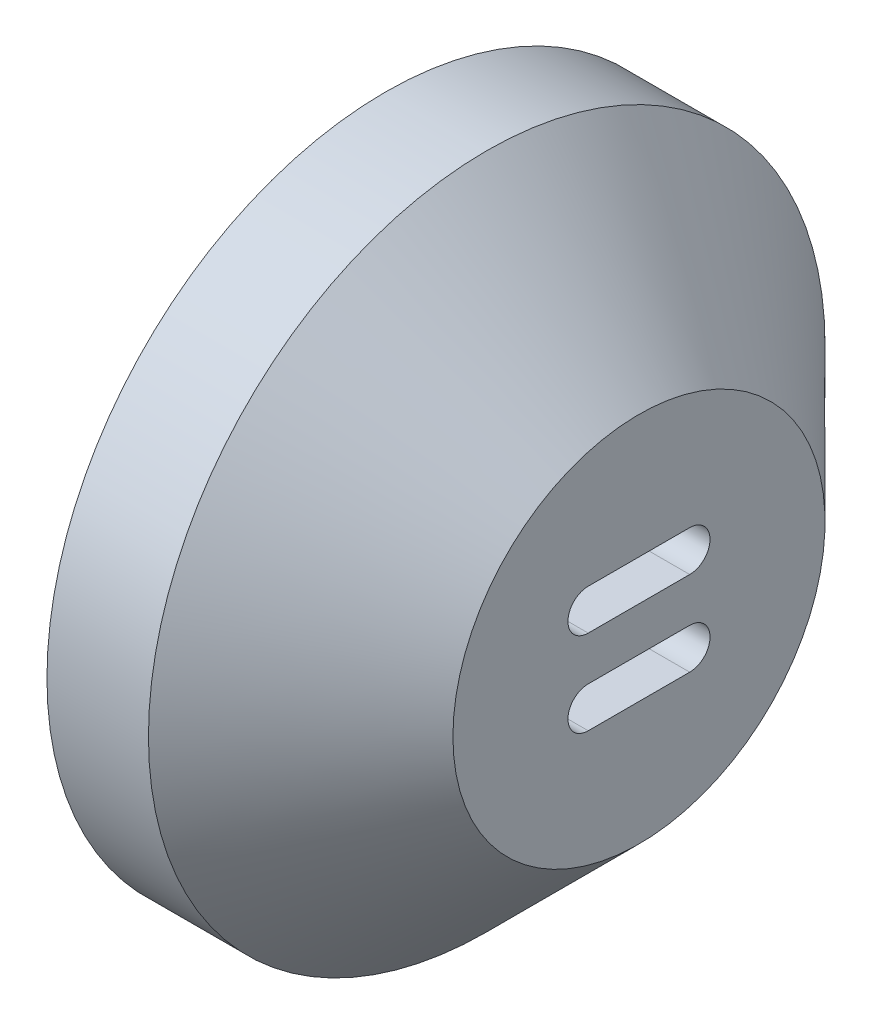
ISO-10303-21;
HEADER;
FILE_DESCRIPTION(('STEP AP214'),'2;1');
FILE_NAME('part.step','',(''),(''),'','','');
FILE_SCHEMA(('AUTOMOTIVE_DESIGN { 1 0 10303 214 1 1 1 1 }'));
ENDSEC;
DATA;
#1=APPLICATION_CONTEXT('core data for automotive mechanical design processes');
#2=APPLICATION_PROTOCOL_DEFINITION('international standard','automotive_design',2000,#1);
#3=PRODUCT_CONTEXT('',#1,'mechanical');
#4=PRODUCT('Part','Part','',(#3));
#5=PRODUCT_RELATED_PRODUCT_CATEGORY('part','',(#4));
#6=PRODUCT_DEFINITION_FORMATION('','',#4);
#7=PRODUCT_DEFINITION_CONTEXT('part definition',#1,'design');
#8=PRODUCT_DEFINITION('design','',#6,#7);
#9=PRODUCT_DEFINITION_SHAPE('','',#8);
#10=(LENGTH_UNIT() NAMED_UNIT(*) SI_UNIT(.MILLI.,.METRE.));
#11=(NAMED_UNIT(*) PLANE_ANGLE_UNIT() SI_UNIT($,.RADIAN.));
#12=(NAMED_UNIT(*) SI_UNIT($,.STERADIAN.) SOLID_ANGLE_UNIT());
#13=UNCERTAINTY_MEASURE_WITH_UNIT(LENGTH_MEASURE(1.E-05),#10,'distance_accuracy_value','');
#14=(GEOMETRIC_REPRESENTATION_CONTEXT(3) GLOBAL_UNCERTAINTY_ASSIGNED_CONTEXT((#13)) GLOBAL_UNIT_ASSIGNED_CONTEXT((#10,
#11,#12)) REPRESENTATION_CONTEXT('',''));
#15=CARTESIAN_POINT('',(0.,0.,0.));
#16=DIRECTION('',(0.,0.,1.));
#17=DIRECTION('',(1.,0.,0.));
#18=AXIS2_PLACEMENT_3D('',#15,#16,#17);
#19=CARTESIAN_POINT('',(63.,-6.07292495320219,0.));
#20=DIRECTION('',(1.,0.,0.));
#21=DIRECTION('',(0.,0.,-1.));
#22=AXIS2_PLACEMENT_3D('',#19,#20,#21);
#23=PLANE('',#22);
#24=CARTESIAN_POINT('',(63.,-56.1023622047251,0.));
#25=DIRECTION('',(-1.,0.,0.));
#26=DIRECTION('',(0.,0.,1.));
#27=AXIS2_PLACEMENT_3D('',#24,#25,#26);
#28=CIRCLE('',#27,50.0294372515229);
#29=CARTESIAN_POINT('',(63.,-56.1023622047251,50.0294372515229));
#30=VERTEX_POINT('',#29);
#31=EDGE_CURVE('E248',#30,#30,#28,.T.);
#32=ORIENTED_EDGE('',*,*,#31,.T.);
#33=EDGE_LOOP('',(#32));
#34=FACE_BOUND('',#33,.T.);
#35=DIRECTION('',(0.,0.,1.));
#36=VECTOR('',#35,1.);
#37=CARTESIAN_POINT('',(63.,-49.6023622047251,-15.));
#38=LINE('',#37,#36);
#39=CARTESIAN_POINT('',(63.,-49.6023622047251,-15.));
#40=VERTEX_POINT('',#39);
#41=CARTESIAN_POINT('',(63.,-49.602362204725,15.));
#42=VERTEX_POINT('',#41);
#43=EDGE_CURVE('E175',#40,#42,#38,.T.);
#44=ORIENTED_EDGE('',*,*,#43,.F.);
#45=CARTESIAN_POINT('',(63.,-43.602362204725,-15.));
#46=DIRECTION('',(-1.,0.,0.));
#47=DIRECTION('',(0.,0.,1.));
#48=AXIS2_PLACEMENT_3D('',#45,#46,#47);
#49=CIRCLE('',#48,6.);
#50=CARTESIAN_POINT('',(63.,-37.602362204725,-15.));
#51=VERTEX_POINT('',#50);
#52=EDGE_CURVE('E156',#51,#40,#49,.T.);
#53=ORIENTED_EDGE('',*,*,#52,.F.);
#54=DIRECTION('',(0.,0.,-1.));
#55=VECTOR('',#54,1.);
#56=CARTESIAN_POINT('',(63.,-37.602362204725,-15.));
#57=LINE('',#56,#55);
#58=CARTESIAN_POINT('',(63.,-37.6023622047251,15.));
#59=VERTEX_POINT('',#58);
#60=EDGE_CURVE('E164',#59,#51,#57,.T.);
#61=ORIENTED_EDGE('',*,*,#60,.F.);
#62=CARTESIAN_POINT('',(63.,-43.602362204725,15.));
#63=DIRECTION('',(-1.,0.,0.));
#64=DIRECTION('',(0.,0.,1.));
#65=AXIS2_PLACEMENT_3D('',#62,#63,#64);
#66=CIRCLE('',#65,6.);
#67=EDGE_CURVE('E178',#42,#59,#66,.T.);
#68=ORIENTED_EDGE('',*,*,#67,.F.);
#69=EDGE_LOOP('',(#44,#53,#61,#68));
#70=FACE_BOUND('',#69,.T.);
#71=CARTESIAN_POINT('',(63.,-68.6023622047251,-15.));
#72=DIRECTION('',(1.,0.,0.));
#73=DIRECTION('',(0.,0.,1.));
#74=AXIS2_PLACEMENT_3D('',#71,#72,#73);
#75=CIRCLE('',#74,6.);
#76=CARTESIAN_POINT('',(63.,-74.6023622047251,-15.));
#77=VERTEX_POINT('',#76);
#78=CARTESIAN_POINT('',(63.,-62.6023622047251,-15.));
#79=VERTEX_POINT('',#78);
#80=EDGE_CURVE('E51',#77,#79,#75,.T.);
#81=ORIENTED_EDGE('',*,*,#80,.T.);
#82=DIRECTION('',(0.,0.,1.));
#83=VECTOR('',#82,1.);
#84=CARTESIAN_POINT('',(63.,-62.6023622047251,-15.));
#85=LINE('',#84,#83);
#86=CARTESIAN_POINT('',(63.,-62.6023622047251,15.));
#87=VERTEX_POINT('',#86);
#88=EDGE_CURVE('E141',#79,#87,#85,.T.);
#89=ORIENTED_EDGE('',*,*,#88,.T.);
#90=CARTESIAN_POINT('',(63.,-68.6023622047251,15.));
#91=DIRECTION('',(1.,0.,0.));
#92=DIRECTION('',(0.,0.,1.));
#93=AXIS2_PLACEMENT_3D('',#90,#91,#92);
#94=CIRCLE('',#93,6.);
#95=CARTESIAN_POINT('',(63.,-74.6023622047251,15.));
#96=VERTEX_POINT('',#95);
#97=EDGE_CURVE('E144',#87,#96,#94,.T.);
#98=ORIENTED_EDGE('',*,*,#97,.T.);
#99=DIRECTION('',(0.,0.,-1.));
#100=VECTOR('',#99,1.);
#101=CARTESIAN_POINT('',(63.,-74.6023622047251,-15.));
#102=LINE('',#101,#100);
#103=EDGE_CURVE('E150',#96,#77,#102,.T.);
#104=ORIENTED_EDGE('',*,*,#103,.T.);
#105=EDGE_LOOP('',(#81,#89,#98,#104));
#106=FACE_BOUND('',#105,.T.);
#107=ADVANCED_FACE('F36',(#34,#70,#106),#23,.F.);
#108=CARTESIAN_POINT('',(75.,-1.10236220472505,0.));
#109=DIRECTION('',(-1.,0.,0.));
#110=DIRECTION('',(0.,0.,1.));
#111=AXIS2_PLACEMENT_3D('',#108,#109,#110);
#112=PLANE('',#111);
#113=CARTESIAN_POINT('',(75.,-56.1023622047251,0.));
#114=DIRECTION('',(-1.,0.,0.));
#115=DIRECTION('',(0.,0.,1.));
#116=AXIS2_PLACEMENT_3D('',#113,#114,#115);
#117=CIRCLE('',#116,55.);
#118=CARTESIAN_POINT('',(75.,-56.1023622047251,55.));
#119=VERTEX_POINT('',#118);
#120=EDGE_CURVE('E245',#119,#119,#117,.T.);
#121=ORIENTED_EDGE('',*,*,#120,.F.);
#122=EDGE_LOOP('',(#121));
#123=FACE_BOUND('',#122,.T.);
#124=DIRECTION('',(0.,0.,-1.));
#125=VECTOR('',#124,1.);
#126=CARTESIAN_POINT('',(75.,-37.602362204725,-15.));
#127=LINE('',#126,#125);
#128=CARTESIAN_POINT('',(75.,-37.6023622047251,15.));
#129=VERTEX_POINT('',#128);
#130=CARTESIAN_POINT('',(75.,-37.602362204725,-15.));
#131=VERTEX_POINT('',#130);
#132=EDGE_CURVE('E170',#129,#131,#127,.T.);
#133=ORIENTED_EDGE('',*,*,#132,.T.);
#134=CARTESIAN_POINT('',(75.,-43.602362204725,-15.));
#135=DIRECTION('',(-1.,0.,0.));
#136=DIRECTION('',(0.,0.,1.));
#137=AXIS2_PLACEMENT_3D('',#134,#135,#136);
#138=CIRCLE('',#137,6.);
#139=CARTESIAN_POINT('',(75.,-49.6023622047251,-15.));
#140=VERTEX_POINT('',#139);
#141=EDGE_CURVE('E160',#131,#140,#138,.T.);
#142=ORIENTED_EDGE('',*,*,#141,.T.);
#143=DIRECTION('',(0.,0.,1.));
#144=VECTOR('',#143,1.);
#145=CARTESIAN_POINT('',(75.,-49.6023622047251,-15.));
#146=LINE('',#145,#144);
#147=CARTESIAN_POINT('',(75.,-49.6023622047251,15.));
#148=VERTEX_POINT('',#147);
#149=EDGE_CURVE('E163',#140,#148,#146,.T.);
#150=ORIENTED_EDGE('',*,*,#149,.T.);
#151=CARTESIAN_POINT('',(75.,-43.602362204725,15.));
#152=DIRECTION('',(-1.,0.,0.));
#153=DIRECTION('',(0.,0.,1.));
#154=AXIS2_PLACEMENT_3D('',#151,#152,#153);
#155=CIRCLE('',#154,6.);
#156=EDGE_CURVE('E167',#148,#129,#155,.T.);
#157=ORIENTED_EDGE('',*,*,#156,.T.);
#158=EDGE_LOOP('',(#133,#142,#150,#157));
#159=FACE_BOUND('',#158,.T.);
#160=CARTESIAN_POINT('',(75.,-68.6023622047251,-15.));
#161=DIRECTION('',(1.,0.,0.));
#162=DIRECTION('',(0.,0.,1.));
#163=AXIS2_PLACEMENT_3D('',#160,#161,#162);
#164=CIRCLE('',#163,6.);
#165=CARTESIAN_POINT('',(75.,-74.6023622047251,-15.));
#166=VERTEX_POINT('',#165);
#167=CARTESIAN_POINT('',(75.,-62.6023622047251,-15.));
#168=VERTEX_POINT('',#167);
#169=EDGE_CURVE('E133',#166,#168,#164,.T.);
#170=ORIENTED_EDGE('',*,*,#169,.F.);
#171=DIRECTION('',(0.,0.,-1.));
#172=VECTOR('',#171,1.);
#173=CARTESIAN_POINT('',(75.,-74.6023622047251,-15.));
#174=LINE('',#173,#172);
#175=CARTESIAN_POINT('',(75.,-74.6023622047251,15.));
#176=VERTEX_POINT('',#175);
#177=EDGE_CURVE('E125',#176,#166,#174,.T.);
#178=ORIENTED_EDGE('',*,*,#177,.F.);
#179=CARTESIAN_POINT('',(75.,-68.6023622047251,15.));
#180=DIRECTION('',(1.,0.,0.));
#181=DIRECTION('',(0.,0.,1.));
#182=AXIS2_PLACEMENT_3D('',#179,#180,#181);
#183=CIRCLE('',#182,6.);
#184=CARTESIAN_POINT('',(75.,-62.6023622047251,15.));
#185=VERTEX_POINT('',#184);
#186=EDGE_CURVE('E132',#185,#176,#183,.T.);
#187=ORIENTED_EDGE('',*,*,#186,.F.);
#188=DIRECTION('',(0.,0.,1.));
#189=VECTOR('',#188,1.);
#190=CARTESIAN_POINT('',(75.,-62.6023622047251,-15.));
#191=LINE('',#190,#189);
#192=EDGE_CURVE('E137',#168,#185,#191,.T.);
#193=ORIENTED_EDGE('',*,*,#192,.F.);
#194=EDGE_LOOP('',(#170,#178,#187,#193));
#195=FACE_BOUND('',#194,.T.);
#196=ADVANCED_FACE('F140',(#123,#159,#195),#112,.F.);
#197=CARTESIAN_POINT('',(0.,43.897637795275,0.));
#198=DIRECTION('',(1.,0.,0.));
#199=DIRECTION('',(0.,0.,-1.));
#200=AXIS2_PLACEMENT_3D('',#197,#198,#199);
#201=PLANE('',#200);
#202=CARTESIAN_POINT('',(0.,10.3656752268112,66.4680374315347));
#203=DIRECTION('',(-1.,0.,0.));
#204=DIRECTION('',(0.,0.,1.));
#205=AXIS2_PLACEMENT_3D('',#202,#203,#204);
#206=CIRCLE('',#205,3.49999999999999);
#207=CARTESIAN_POINT('',(0.,10.3656752268112,69.9680374315347));
#208=VERTEX_POINT('',#207);
#209=EDGE_CURVE('E185',#208,#208,#206,.T.);
#210=ORIENTED_EDGE('',*,*,#209,.F.);
#211=EDGE_LOOP('',(#210));
#212=FACE_BOUND('',#211,.T.);
#213=CARTESIAN_POINT('',(0.,-56.1023622047241,94.));
#214=DIRECTION('',(-1.,0.,0.));
#215=DIRECTION('',(0.,0.,1.));
#216=AXIS2_PLACEMENT_3D('',#213,#214,#215);
#217=CIRCLE('',#216,3.49999999999999);
#218=CARTESIAN_POINT('',(0.,-56.1023622047241,97.5));
#219=VERTEX_POINT('',#218);
#220=EDGE_CURVE('E197',#219,#219,#217,.T.);
#221=ORIENTED_EDGE('',*,*,#220,.F.);
#222=EDGE_LOOP('',(#221));
#223=FACE_BOUND('',#222,.T.);
#224=CARTESIAN_POINT('',(0.,-122.57039963626,66.468037431536));
#225=DIRECTION('',(-1.,0.,0.));
#226=DIRECTION('',(0.,0.,1.));
#227=AXIS2_PLACEMENT_3D('',#224,#225,#226);
#228=CIRCLE('',#227,3.49999999999999);
#229=CARTESIAN_POINT('',(0.,-122.57039963626,69.968037431536));
#230=VERTEX_POINT('',#229);
#231=EDGE_CURVE('E203',#230,#230,#228,.T.);
#232=ORIENTED_EDGE('',*,*,#231,.F.);
#233=EDGE_LOOP('',(#232));
#234=FACE_BOUND('',#233,.T.);
#235=CARTESIAN_POINT('',(0.,-150.102362204725,0.));
#236=DIRECTION('',(-1.,0.,0.));
#237=DIRECTION('',(0.,0.,1.));
#238=AXIS2_PLACEMENT_3D('',#235,#236,#237);
#239=CIRCLE('',#238,3.5);
#240=CARTESIAN_POINT('',(0.,-150.102362204725,3.5));
#241=VERTEX_POINT('',#240);
#242=EDGE_CURVE('E209',#241,#241,#239,.T.);
#243=ORIENTED_EDGE('',*,*,#242,.F.);
#244=EDGE_LOOP('',(#243));
#245=FACE_BOUND('',#244,.T.);
#246=CARTESIAN_POINT('',(0.,-122.570399636261,-66.4680374315351));
#247=DIRECTION('',(-1.,0.,0.));
#248=DIRECTION('',(0.,0.,1.));
#249=AXIS2_PLACEMENT_3D('',#246,#247,#248);
#250=CIRCLE('',#249,3.49999999999999);
#251=CARTESIAN_POINT('',(0.,-122.570399636261,-62.9680374315351));
#252=VERTEX_POINT('',#251);
#253=EDGE_CURVE('E215',#252,#252,#250,.T.);
#254=ORIENTED_EDGE('',*,*,#253,.F.);
#255=EDGE_LOOP('',(#254));
#256=FACE_BOUND('',#255,.T.);
#257=CARTESIAN_POINT('',(0.,-56.1023622047254,-94.));
#258=DIRECTION('',(-1.,0.,0.));
#259=DIRECTION('',(0.,0.,1.));
#260=AXIS2_PLACEMENT_3D('',#257,#258,#259);
#261=CIRCLE('',#260,3.49999999999999);
#262=CARTESIAN_POINT('',(0.,-56.1023622047254,-90.5));
#263=VERTEX_POINT('',#262);
#264=EDGE_CURVE('E221',#263,#263,#261,.T.);
#265=ORIENTED_EDGE('',*,*,#264,.F.);
#266=EDGE_LOOP('',(#265));
#267=FACE_BOUND('',#266,.T.);
#268=CARTESIAN_POINT('',(0.,10.3656752268103,-66.4680374315356));
#269=DIRECTION('',(-1.,0.,0.));
#270=DIRECTION('',(0.,0.,1.));
#271=AXIS2_PLACEMENT_3D('',#268,#269,#270);
#272=CIRCLE('',#271,3.49999999999999);
#273=CARTESIAN_POINT('',(0.,10.3656752268103,-62.9680374315356));
#274=VERTEX_POINT('',#273);
#275=EDGE_CURVE('E227',#274,#274,#272,.T.);
#276=ORIENTED_EDGE('',*,*,#275,.F.);
#277=EDGE_LOOP('',(#276));
#278=FACE_BOUND('',#277,.T.);
#279=CARTESIAN_POINT('',(0.,37.8976377952749,0.));
#280=DIRECTION('',(-1.,0.,0.));
#281=DIRECTION('',(0.,0.,1.));
#282=AXIS2_PLACEMENT_3D('',#279,#280,#281);
#283=CIRCLE('',#282,3.49999999999999);
#284=CARTESIAN_POINT('',(0.,37.8976377952749,3.49999999999999));
#285=VERTEX_POINT('',#284);
#286=EDGE_CURVE('E233',#285,#285,#283,.T.);
#287=ORIENTED_EDGE('',*,*,#286,.F.);
#288=EDGE_LOOP('',(#287));
#289=FACE_BOUND('',#288,.T.);
#290=CARTESIAN_POINT('',(0.,-56.1023622047251,0.));
#291=DIRECTION('',(-1.,0.,0.));
#292=DIRECTION('',(0.,0.,1.));
#293=AXIS2_PLACEMENT_3D('',#290,#291,#292);
#294=CIRCLE('',#293,88.);
#295=CARTESIAN_POINT('',(0.,-56.1023622047251,88.));
#296=VERTEX_POINT('',#295);
#297=EDGE_CURVE('E11',#296,#296,#294,.T.);
#298=ORIENTED_EDGE('',*,*,#297,.F.);
#299=EDGE_LOOP('',(#298));
#300=FACE_BOUND('',#299,.T.);
#301=CARTESIAN_POINT('',(0.,-56.1023622047251,0.));
#302=DIRECTION('',(-1.,0.,0.));
#303=DIRECTION('',(0.,0.,1.));
#304=AXIS2_PLACEMENT_3D('',#301,#302,#303);
#305=CIRCLE('',#304,100.);
#306=CARTESIAN_POINT('',(0.,-56.1023622047251,100.));
#307=VERTEX_POINT('',#306);
#308=EDGE_CURVE('E239',#307,#307,#305,.T.);
#309=ORIENTED_EDGE('',*,*,#308,.T.);
#310=EDGE_LOOP('',(#309));
#311=FACE_BOUND('',#310,.T.);
#312=ADVANCED_FACE('F38',(#212,#223,#234,#245,#256,#267,#278,#289,#300,#311),#201,.F.);
#313=CARTESIAN_POINT('',(63.,-56.1023622047251,0.));
#314=DIRECTION('',(-1.,0.,0.));
#315=DIRECTION('',(0.,0.,1.));
#316=AXIS2_PLACEMENT_3D('',#313,#314,#315);
#317=CYLINDRICAL_SURFACE('',#316,88.);
#318=CARTESIAN_POINT('',(25.0294372515229,-56.1023622047251,0.));
#319=DIRECTION('',(-1.,0.,0.));
#320=DIRECTION('',(0.,0.,1.));
#321=AXIS2_PLACEMENT_3D('',#318,#319,#320);
#322=CIRCLE('',#321,88.);
#323=CARTESIAN_POINT('',(25.0294372515229,-56.1023622047251,88.));
#324=VERTEX_POINT('',#323);
#325=EDGE_CURVE('E44',#324,#324,#322,.T.);
#326=ORIENTED_EDGE('',*,*,#325,.F.);
#327=EDGE_LOOP('',(#326));
#328=FACE_BOUND('',#327,.T.);
#329=ORIENTED_EDGE('',*,*,#297,.T.);
#330=EDGE_LOOP('',(#329));
#331=FACE_BOUND('',#330,.T.);
#332=ADVANCED_FACE('F255',(#328,#331),#317,.F.);
#333=CARTESIAN_POINT('',(25.0294372515229,-56.1023622047251,0.));
#334=DIRECTION('',(-1.,0.,0.));
#335=DIRECTION('',(0.,0.,1.));
#336=AXIS2_PLACEMENT_3D('',#333,#334,#335);
#337=CONICAL_SURFACE('',#336,88.,0.785398163397448);
#338=ORIENTED_EDGE('',*,*,#31,.F.);
#339=EDGE_LOOP('',(#338));
#340=FACE_BOUND('',#339,.T.);
#341=ORIENTED_EDGE('',*,*,#325,.T.);
#342=EDGE_LOOP('',(#341));
#343=FACE_BOUND('',#342,.T.);
#344=ADVANCED_FACE('F253',(#340,#343),#337,.F.);
#345=CARTESIAN_POINT('',(75.,-56.1023622047251,0.));
#346=DIRECTION('',(-1.,0.,0.));
#347=DIRECTION('',(0.,0.,1.));
#348=AXIS2_PLACEMENT_3D('',#345,#346,#347);
#349=CONICAL_SURFACE('',#348,55.,0.785398163397448);
#350=CARTESIAN_POINT('',(30.,-56.1023622047251,0.));
#351=DIRECTION('',(-1.,0.,0.));
#352=DIRECTION('',(0.,0.,1.));
#353=AXIS2_PLACEMENT_3D('',#350,#351,#352);
#354=CIRCLE('',#353,100.);
#355=CARTESIAN_POINT('',(30.,-56.1023622047251,100.));
#356=VERTEX_POINT('',#355);
#357=EDGE_CURVE('E242',#356,#356,#354,.T.);
#358=ORIENTED_EDGE('',*,*,#357,.F.);
#359=EDGE_LOOP('',(#358));
#360=FACE_BOUND('',#359,.T.);
#361=ORIENTED_EDGE('',*,*,#120,.T.);
#362=EDGE_LOOP('',(#361));
#363=FACE_BOUND('',#362,.T.);
#364=ADVANCED_FACE('F269',(#360,#363),#349,.T.);
#365=CARTESIAN_POINT('',(63.,-56.1023622047251,0.));
#366=DIRECTION('',(-1.,0.,0.));
#367=DIRECTION('',(0.,0.,1.));
#368=AXIS2_PLACEMENT_3D('',#365,#366,#367);
#369=CYLINDRICAL_SURFACE('',#368,100.);
#370=ORIENTED_EDGE('',*,*,#308,.F.);
#371=EDGE_LOOP('',(#370));
#372=FACE_BOUND('',#371,.T.);
#373=ORIENTED_EDGE('',*,*,#357,.T.);
#374=EDGE_LOOP('',(#373));
#375=FACE_BOUND('',#374,.T.);
#376=ADVANCED_FACE('F265',(#372,#375),#369,.T.);
#377=CARTESIAN_POINT('',(21.,37.8976377952749,0.));
#378=DIRECTION('',(-1.,0.,0.));
#379=DIRECTION('',(0.,0.,1.));
#380=AXIS2_PLACEMENT_3D('',#377,#378,#379);
#381=CONICAL_SURFACE('',#380,3.49999999999999,1.02974425867665);
#382=CARTESIAN_POINT('',(23.1030121665965,37.8976377952749,0.));
#383=VERTEX_POINT('',#382);
#384=VERTEX_LOOP('',#383);
#385=FACE_BOUND('',#384,.T.);
#386=CARTESIAN_POINT('',(21.,37.8976377952749,0.));
#387=DIRECTION('',(-1.,0.,0.));
#388=DIRECTION('',(0.,0.,1.));
#389=AXIS2_PLACEMENT_3D('',#386,#387,#388);
#390=CIRCLE('',#389,3.49999999999999);
#391=CARTESIAN_POINT('',(21.,37.8976377952749,3.49999999999999));
#392=VERTEX_POINT('',#391);
#393=EDGE_CURVE('E236',#392,#392,#390,.T.);
#394=ORIENTED_EDGE('',*,*,#393,.T.);
#395=EDGE_LOOP('',(#394));
#396=FACE_BOUND('',#395,.T.);
#397=ADVANCED_FACE('F268',(#385,#396),#381,.F.);
#398=CARTESIAN_POINT('',(0.,37.8976377952749,0.));
#399=DIRECTION('',(-1.,0.,0.));
#400=DIRECTION('',(0.,0.,1.));
#401=AXIS2_PLACEMENT_3D('',#398,#399,#400);
#402=CYLINDRICAL_SURFACE('',#401,3.49999999999999);
#403=ORIENTED_EDGE('',*,*,#393,.F.);
#404=EDGE_LOOP('',(#403));
#405=FACE_BOUND('',#404,.T.);
#406=ORIENTED_EDGE('',*,*,#286,.T.);
#407=EDGE_LOOP('',(#406));
#408=FACE_BOUND('',#407,.T.);
#409=ADVANCED_FACE('F382',(#405,#408),#402,.F.);
#410=CARTESIAN_POINT('',(21.,10.3656752268103,-66.4680374315356));
#411=DIRECTION('',(-1.,0.,0.));
#412=DIRECTION('',(0.,0.,1.));
#413=AXIS2_PLACEMENT_3D('',#410,#411,#412);
#414=CONICAL_SURFACE('',#413,3.49999999999999,1.02974425867665);
#415=CARTESIAN_POINT('',(23.1030121665965,10.3656752268103,-66.4680374315356));
#416=VERTEX_POINT('',#415);
#417=VERTEX_LOOP('',#416);
#418=FACE_BOUND('',#417,.T.);
#419=CARTESIAN_POINT('',(21.,10.3656752268103,-66.4680374315356));
#420=DIRECTION('',(-1.,0.,0.));
#421=DIRECTION('',(0.,0.,1.));
#422=AXIS2_PLACEMENT_3D('',#419,#420,#421);
#423=CIRCLE('',#422,3.49999999999999);
#424=CARTESIAN_POINT('',(21.,10.3656752268103,-62.9680374315356));
#425=VERTEX_POINT('',#424);
#426=EDGE_CURVE('E230',#425,#425,#423,.T.);
#427=ORIENTED_EDGE('',*,*,#426,.T.);
#428=EDGE_LOOP('',(#427));
#429=FACE_BOUND('',#428,.T.);
#430=ADVANCED_FACE('F378',(#418,#429),#414,.F.);
#431=CARTESIAN_POINT('',(0.,10.3656752268103,-66.4680374315356));
#432=DIRECTION('',(-1.,0.,0.));
#433=DIRECTION('',(0.,0.,1.));
#434=AXIS2_PLACEMENT_3D('',#431,#432,#433);
#435=CYLINDRICAL_SURFACE('',#434,3.49999999999999);
#436=ORIENTED_EDGE('',*,*,#426,.F.);
#437=EDGE_LOOP('',(#436));
#438=FACE_BOUND('',#437,.T.);
#439=ORIENTED_EDGE('',*,*,#275,.T.);
#440=EDGE_LOOP('',(#439));
#441=FACE_BOUND('',#440,.T.);
#442=ADVANCED_FACE('F374',(#438,#441),#435,.F.);
#443=CARTESIAN_POINT('',(21.,-56.1023622047254,-94.));
#444=DIRECTION('',(-1.,0.,0.));
#445=DIRECTION('',(0.,0.,1.));
#446=AXIS2_PLACEMENT_3D('',#443,#444,#445);
#447=CONICAL_SURFACE('',#446,3.49999999999999,1.02974425867665);
#448=CARTESIAN_POINT('',(23.1030121665965,-56.1023622047254,-94.));
#449=VERTEX_POINT('',#448);
#450=VERTEX_LOOP('',#449);
#451=FACE_BOUND('',#450,.T.);
#452=CARTESIAN_POINT('',(21.,-56.1023622047254,-94.));
#453=DIRECTION('',(-1.,0.,0.));
#454=DIRECTION('',(0.,0.,1.));
#455=AXIS2_PLACEMENT_3D('',#452,#453,#454);
#456=CIRCLE('',#455,3.49999999999999);
#457=CARTESIAN_POINT('',(21.,-56.1023622047254,-90.5));
#458=VERTEX_POINT('',#457);
#459=EDGE_CURVE('E224',#458,#458,#456,.T.);
#460=ORIENTED_EDGE('',*,*,#459,.T.);
#461=EDGE_LOOP('',(#460));
#462=FACE_BOUND('',#461,.T.);
#463=ADVANCED_FACE('F370',(#451,#462),#447,.F.);
#464=CARTESIAN_POINT('',(0.,-56.1023622047254,-94.));
#465=DIRECTION('',(-1.,0.,0.));
#466=DIRECTION('',(0.,0.,1.));
#467=AXIS2_PLACEMENT_3D('',#464,#465,#466);
#468=CYLINDRICAL_SURFACE('',#467,3.49999999999999);
#469=ORIENTED_EDGE('',*,*,#459,.F.);
#470=EDGE_LOOP('',(#469));
#471=FACE_BOUND('',#470,.T.);
#472=ORIENTED_EDGE('',*,*,#264,.T.);
#473=EDGE_LOOP('',(#472));
#474=FACE_BOUND('',#473,.T.);
#475=ADVANCED_FACE('F366',(#471,#474),#468,.F.);
#476=CARTESIAN_POINT('',(21.,-122.570399636261,-66.4680374315351));
#477=DIRECTION('',(-1.,0.,0.));
#478=DIRECTION('',(0.,0.,1.));
#479=AXIS2_PLACEMENT_3D('',#476,#477,#478);
#480=CONICAL_SURFACE('',#479,3.49999999999999,1.02974425867665);
#481=CARTESIAN_POINT('',(23.1030121665965,-122.570399636261,-66.4680374315351));
#482=VERTEX_POINT('',#481);
#483=VERTEX_LOOP('',#482);
#484=FACE_BOUND('',#483,.T.);
#485=CARTESIAN_POINT('',(21.,-122.570399636261,-66.4680374315351));
#486=DIRECTION('',(-1.,0.,0.));
#487=DIRECTION('',(0.,0.,1.));
#488=AXIS2_PLACEMENT_3D('',#485,#486,#487);
#489=CIRCLE('',#488,3.49999999999999);
#490=CARTESIAN_POINT('',(21.,-122.570399636261,-62.9680374315351));
#491=VERTEX_POINT('',#490);
#492=EDGE_CURVE('E218',#491,#491,#489,.T.);
#493=ORIENTED_EDGE('',*,*,#492,.T.);
#494=EDGE_LOOP('',(#493));
#495=FACE_BOUND('',#494,.T.);
#496=ADVANCED_FACE('F362',(#484,#495),#480,.F.);
#497=CARTESIAN_POINT('',(0.,-122.570399636261,-66.4680374315351));
#498=DIRECTION('',(-1.,0.,0.));
#499=DIRECTION('',(0.,0.,1.));
#500=AXIS2_PLACEMENT_3D('',#497,#498,#499);
#501=CYLINDRICAL_SURFACE('',#500,3.49999999999999);
#502=ORIENTED_EDGE('',*,*,#492,.F.);
#503=EDGE_LOOP('',(#502));
#504=FACE_BOUND('',#503,.T.);
#505=ORIENTED_EDGE('',*,*,#253,.T.);
#506=EDGE_LOOP('',(#505));
#507=FACE_BOUND('',#506,.T.);
#508=ADVANCED_FACE('F358',(#504,#507),#501,.F.);
#509=CARTESIAN_POINT('',(21.,-150.102362204725,0.));
#510=DIRECTION('',(-1.,0.,0.));
#511=DIRECTION('',(0.,0.,1.));
#512=AXIS2_PLACEMENT_3D('',#509,#510,#511);
#513=CONICAL_SURFACE('',#512,3.49999999999998,1.02974425867665);
#514=CARTESIAN_POINT('',(23.1030121665965,-150.102362204725,0.));
#515=VERTEX_POINT('',#514);
#516=VERTEX_LOOP('',#515);
#517=FACE_BOUND('',#516,.T.);
#518=CARTESIAN_POINT('',(21.,-150.102362204725,0.));
#519=DIRECTION('',(-1.,0.,0.));
#520=DIRECTION('',(0.,0.,1.));
#521=AXIS2_PLACEMENT_3D('',#518,#519,#520);
#522=CIRCLE('',#521,3.49999999999998);
#523=CARTESIAN_POINT('',(21.,-150.102362204725,3.49999999999998));
#524=VERTEX_POINT('',#523);
#525=EDGE_CURVE('E212',#524,#524,#522,.T.);
#526=ORIENTED_EDGE('',*,*,#525,.T.);
#527=EDGE_LOOP('',(#526));
#528=FACE_BOUND('',#527,.T.);
#529=ADVANCED_FACE('F354',(#517,#528),#513,.F.);
#530=CARTESIAN_POINT('',(0.,-150.102362204725,0.));
#531=DIRECTION('',(-1.,0.,0.));
#532=DIRECTION('',(0.,0.,1.));
#533=AXIS2_PLACEMENT_3D('',#530,#531,#532);
#534=CYLINDRICAL_SURFACE('',#533,3.49999999999999);
#535=ORIENTED_EDGE('',*,*,#525,.F.);
#536=EDGE_LOOP('',(#535));
#537=FACE_BOUND('',#536,.T.);
#538=ORIENTED_EDGE('',*,*,#242,.T.);
#539=EDGE_LOOP('',(#538));
#540=FACE_BOUND('',#539,.T.);
#541=ADVANCED_FACE('F350',(#537,#540),#534,.F.);
#542=CARTESIAN_POINT('',(21.,-122.57039963626,66.468037431536));
#543=DIRECTION('',(-1.,0.,0.));
#544=DIRECTION('',(0.,0.,1.));
#545=AXIS2_PLACEMENT_3D('',#542,#543,#544);
#546=CONICAL_SURFACE('',#545,3.49999999999999,1.02974425867665);
#547=CARTESIAN_POINT('',(23.1030121665965,-122.57039963626,66.468037431536));
#548=VERTEX_POINT('',#547);
#549=VERTEX_LOOP('',#548);
#550=FACE_BOUND('',#549,.T.);
#551=CARTESIAN_POINT('',(21.,-122.57039963626,66.468037431536));
#552=DIRECTION('',(-1.,0.,0.));
#553=DIRECTION('',(0.,0.,1.));
#554=AXIS2_PLACEMENT_3D('',#551,#552,#553);
#555=CIRCLE('',#554,3.49999999999999);
#556=CARTESIAN_POINT('',(21.,-122.57039963626,69.968037431536));
#557=VERTEX_POINT('',#556);
#558=EDGE_CURVE('E206',#557,#557,#555,.T.);
#559=ORIENTED_EDGE('',*,*,#558,.T.);
#560=EDGE_LOOP('',(#559));
#561=FACE_BOUND('',#560,.T.);
#562=ADVANCED_FACE('F346',(#550,#561),#546,.F.);
#563=CARTESIAN_POINT('',(0.,-122.57039963626,66.468037431536));
#564=DIRECTION('',(-1.,0.,0.));
#565=DIRECTION('',(0.,0.,1.));
#566=AXIS2_PLACEMENT_3D('',#563,#564,#565);
#567=CYLINDRICAL_SURFACE('',#566,3.49999999999999);
#568=ORIENTED_EDGE('',*,*,#558,.F.);
#569=EDGE_LOOP('',(#568));
#570=FACE_BOUND('',#569,.T.);
#571=ORIENTED_EDGE('',*,*,#231,.T.);
#572=EDGE_LOOP('',(#571));
#573=FACE_BOUND('',#572,.T.);
#574=ADVANCED_FACE('F342',(#570,#573),#567,.F.);
#575=CARTESIAN_POINT('',(21.,-56.1023622047241,94.));
#576=DIRECTION('',(-1.,0.,0.));
#577=DIRECTION('',(0.,0.,1.));
#578=AXIS2_PLACEMENT_3D('',#575,#576,#577);
#579=CONICAL_SURFACE('',#578,3.49999999999999,1.02974425867665);
#580=CARTESIAN_POINT('',(23.1030121665965,-56.1023622047241,94.));
#581=VERTEX_POINT('',#580);
#582=VERTEX_LOOP('',#581);
#583=FACE_BOUND('',#582,.T.);
#584=CARTESIAN_POINT('',(21.,-56.1023622047241,94.));
#585=DIRECTION('',(-1.,0.,0.));
#586=DIRECTION('',(0.,0.,1.));
#587=AXIS2_PLACEMENT_3D('',#584,#585,#586);
#588=CIRCLE('',#587,3.49999999999999);
#589=CARTESIAN_POINT('',(21.,-56.1023622047241,97.5));
#590=VERTEX_POINT('',#589);
#591=EDGE_CURVE('E200',#590,#590,#588,.T.);
#592=ORIENTED_EDGE('',*,*,#591,.T.);
#593=EDGE_LOOP('',(#592));
#594=FACE_BOUND('',#593,.T.);
#595=ADVANCED_FACE('F338',(#583,#594),#579,.F.);
#596=CARTESIAN_POINT('',(0.,-56.1023622047241,94.));
#597=DIRECTION('',(-1.,0.,0.));
#598=DIRECTION('',(0.,0.,1.));
#599=AXIS2_PLACEMENT_3D('',#596,#597,#598);
#600=CYLINDRICAL_SURFACE('',#599,3.49999999999999);
#601=ORIENTED_EDGE('',*,*,#591,.F.);
#602=EDGE_LOOP('',(#601));
#603=FACE_BOUND('',#602,.T.);
#604=ORIENTED_EDGE('',*,*,#220,.T.);
#605=EDGE_LOOP('',(#604));
#606=FACE_BOUND('',#605,.T.);
#607=ADVANCED_FACE('F334',(#603,#606),#600,.F.);
#608=CARTESIAN_POINT('',(21.,10.3656752268112,66.4680374315347));
#609=DIRECTION('',(-1.,0.,0.));
#610=DIRECTION('',(0.,0.,1.));
#611=AXIS2_PLACEMENT_3D('',#608,#609,#610);
#612=CONICAL_SURFACE('',#611,3.49999999999999,1.02974425867665);
#613=CARTESIAN_POINT('',(23.1030121665965,10.3656752268112,66.4680374315347));
#614=VERTEX_POINT('',#613);
#615=VERTEX_LOOP('',#614);
#616=FACE_BOUND('',#615,.T.);
#617=CARTESIAN_POINT('',(21.,10.3656752268112,66.4680374315347));
#618=DIRECTION('',(-1.,0.,0.));
#619=DIRECTION('',(0.,0.,1.));
#620=AXIS2_PLACEMENT_3D('',#617,#618,#619);
#621=CIRCLE('',#620,3.49999999999999);
#622=CARTESIAN_POINT('',(21.,10.3656752268112,69.9680374315347));
#623=VERTEX_POINT('',#622);
#624=EDGE_CURVE('E194',#623,#623,#621,.T.);
#625=ORIENTED_EDGE('',*,*,#624,.T.);
#626=EDGE_LOOP('',(#625));
#627=FACE_BOUND('',#626,.T.);
#628=ADVANCED_FACE('F330',(#616,#627),#612,.F.);
#629=CARTESIAN_POINT('',(0.,10.3656752268112,66.4680374315347));
#630=DIRECTION('',(-1.,0.,0.));
#631=DIRECTION('',(0.,0.,1.));
#632=AXIS2_PLACEMENT_3D('',#629,#630,#631);
#633=CYLINDRICAL_SURFACE('',#632,3.49999999999999);
#634=ORIENTED_EDGE('',*,*,#624,.F.);
#635=EDGE_LOOP('',(#634));
#636=FACE_BOUND('',#635,.T.);
#637=ORIENTED_EDGE('',*,*,#209,.T.);
#638=EDGE_LOOP('',(#637));
#639=FACE_BOUND('',#638,.T.);
#640=ADVANCED_FACE('F327',(#636,#639),#633,.F.);
#641=CARTESIAN_POINT('',(75.,-43.602362204725,-15.));
#642=DIRECTION('',(-1.,0.,0.));
#643=DIRECTION('',(0.,0.,1.));
#644=AXIS2_PLACEMENT_3D('',#641,#642,#643);
#645=CYLINDRICAL_SURFACE('',#644,6.);
#646=ORIENTED_EDGE('',*,*,#52,.T.);
#647=DIRECTION('',(-1.,0.,0.));
#648=VECTOR('',#647,1.);
#649=CARTESIAN_POINT('',(75.,-49.6023622047251,-15.));
#650=LINE('',#649,#648);
#651=EDGE_CURVE('E173',#140,#40,#650,.T.);
#652=ORIENTED_EDGE('',*,*,#651,.F.);
#653=ORIENTED_EDGE('',*,*,#141,.F.);
#654=DIRECTION('',(-1.,0.,0.));
#655=VECTOR('',#654,1.);
#656=CARTESIAN_POINT('',(75.,-37.602362204725,-15.));
#657=LINE('',#656,#655);
#658=EDGE_CURVE('E183',#131,#51,#657,.T.);
#659=ORIENTED_EDGE('',*,*,#658,.T.);
#660=EDGE_LOOP('',(#646,#652,#653,#659));
#661=FACE_BOUND('',#660,.T.);
#662=ADVANCED_FACE('F288',(#661),#645,.F.);
#663=CARTESIAN_POINT('',(75.,-37.602362204725,-15.));
#664=DIRECTION('',(0.,1.,0.));
#665=DIRECTION('',(0.,0.,1.));
#666=AXIS2_PLACEMENT_3D('',#663,#664,#665);
#667=PLANE('',#666);
#668=ORIENTED_EDGE('',*,*,#60,.T.);
#669=ORIENTED_EDGE('',*,*,#658,.F.);
#670=ORIENTED_EDGE('',*,*,#132,.F.);
#671=DIRECTION('',(-1.,0.,0.));
#672=VECTOR('',#671,1.);
#673=CARTESIAN_POINT('',(75.,-37.6023622047251,15.));
#674=LINE('',#673,#672);
#675=EDGE_CURVE('E186',#129,#59,#674,.T.);
#676=ORIENTED_EDGE('',*,*,#675,.T.);
#677=EDGE_LOOP('',(#668,#669,#670,#676));
#678=FACE_BOUND('',#677,.T.);
#679=ADVANCED_FACE('F284',(#678),#667,.F.);
#680=CARTESIAN_POINT('',(75.,-43.602362204725,15.));
#681=DIRECTION('',(-1.,0.,0.));
#682=DIRECTION('',(0.,0.,1.));
#683=AXIS2_PLACEMENT_3D('',#680,#681,#682);
#684=CYLINDRICAL_SURFACE('',#683,6.);
#685=ORIENTED_EDGE('',*,*,#67,.T.);
#686=ORIENTED_EDGE('',*,*,#675,.F.);
#687=ORIENTED_EDGE('',*,*,#156,.F.);
#688=DIRECTION('',(-1.,0.,0.));
#689=VECTOR('',#688,1.);
#690=CARTESIAN_POINT('',(75.,-49.602362204725,15.));
#691=LINE('',#690,#689);
#692=EDGE_CURVE('E188',#148,#42,#691,.T.);
#693=ORIENTED_EDGE('',*,*,#692,.T.);
#694=EDGE_LOOP('',(#685,#686,#687,#693));
#695=FACE_BOUND('',#694,.T.);
#696=ADVANCED_FACE('F296',(#695),#684,.F.);
#697=CARTESIAN_POINT('',(75.,-49.6023622047251,-15.));
#698=DIRECTION('',(0.,-1.,0.));
#699=DIRECTION('',(0.,0.,-1.));
#700=AXIS2_PLACEMENT_3D('',#697,#698,#699);
#701=PLANE('',#700);
#702=ORIENTED_EDGE('',*,*,#43,.T.);
#703=ORIENTED_EDGE('',*,*,#692,.F.);
#704=ORIENTED_EDGE('',*,*,#149,.F.);
#705=ORIENTED_EDGE('',*,*,#651,.T.);
#706=EDGE_LOOP('',(#702,#703,#704,#705));
#707=FACE_BOUND('',#706,.T.);
#708=ADVANCED_FACE('F293',(#707),#701,.F.);
#709=CARTESIAN_POINT('',(75.,-68.6023622047251,-15.));
#710=DIRECTION('',(-1.,0.,0.));
#711=DIRECTION('',(0.,0.,1.));
#712=AXIS2_PLACEMENT_3D('',#709,#710,#711);
#713=CYLINDRICAL_SURFACE('',#712,6.);
#714=ORIENTED_EDGE('',*,*,#80,.F.);
#715=DIRECTION('',(-1.,0.,0.));
#716=VECTOR('',#715,1.);
#717=CARTESIAN_POINT('',(75.,-74.6023622047251,-15.));
#718=LINE('',#717,#716);
#719=EDGE_CURVE('E127',#166,#77,#718,.T.);
#720=ORIENTED_EDGE('',*,*,#719,.F.);
#721=ORIENTED_EDGE('',*,*,#169,.T.);
#722=DIRECTION('',(-1.,0.,0.));
#723=VECTOR('',#722,1.);
#724=CARTESIAN_POINT('',(75.,-62.6023622047251,-15.));
#725=LINE('',#724,#723);
#726=EDGE_CURVE('E154',#168,#79,#725,.T.);
#727=ORIENTED_EDGE('',*,*,#726,.T.);
#728=EDGE_LOOP('',(#714,#720,#721,#727));
#729=FACE_BOUND('',#728,.T.);
#730=ADVANCED_FACE('F135',(#729),#713,.F.);
#731=CARTESIAN_POINT('',(75.,-62.6023622047251,-15.));
#732=DIRECTION('',(0.,-1.,0.));
#733=DIRECTION('',(0.,0.,-1.));
#734=AXIS2_PLACEMENT_3D('',#731,#732,#733);
#735=PLANE('',#734);
#736=ORIENTED_EDGE('',*,*,#88,.F.);
#737=ORIENTED_EDGE('',*,*,#726,.F.);
#738=ORIENTED_EDGE('',*,*,#192,.T.);
#739=DIRECTION('',(-1.,0.,0.));
#740=VECTOR('',#739,1.);
#741=CARTESIAN_POINT('',(75.,-62.6023622047251,15.));
#742=LINE('',#741,#740);
#743=EDGE_CURVE('E157',#185,#87,#742,.T.);
#744=ORIENTED_EDGE('',*,*,#743,.T.);
#745=EDGE_LOOP('',(#736,#737,#738,#744));
#746=FACE_BOUND('',#745,.T.);
#747=ADVANCED_FACE('F307',(#746),#735,.T.);
#748=CARTESIAN_POINT('',(75.,-68.6023622047251,15.));
#749=DIRECTION('',(-1.,0.,0.));
#750=DIRECTION('',(0.,0.,1.));
#751=AXIS2_PLACEMENT_3D('',#748,#749,#750);
#752=CYLINDRICAL_SURFACE('',#751,6.);
#753=ORIENTED_EDGE('',*,*,#97,.F.);
#754=ORIENTED_EDGE('',*,*,#743,.F.);
#755=ORIENTED_EDGE('',*,*,#186,.T.);
#756=DIRECTION('',(-1.,0.,0.));
#757=VECTOR('',#756,1.);
#758=CARTESIAN_POINT('',(75.,-74.6023622047251,15.));
#759=LINE('',#758,#757);
#760=EDGE_CURVE('E59',#176,#96,#759,.T.);
#761=ORIENTED_EDGE('',*,*,#760,.T.);
#762=EDGE_LOOP('',(#753,#754,#755,#761));
#763=FACE_BOUND('',#762,.T.);
#764=ADVANCED_FACE('F305',(#763),#752,.F.);
#765=CARTESIAN_POINT('',(75.,-74.6023622047251,-15.));
#766=DIRECTION('',(0.,1.,0.));
#767=DIRECTION('',(0.,0.,1.));
#768=AXIS2_PLACEMENT_3D('',#765,#766,#767);
#769=PLANE('',#768);
#770=ORIENTED_EDGE('',*,*,#103,.F.);
#771=ORIENTED_EDGE('',*,*,#760,.F.);
#772=ORIENTED_EDGE('',*,*,#177,.T.);
#773=ORIENTED_EDGE('',*,*,#719,.T.);
#774=EDGE_LOOP('',(#770,#771,#772,#773));
#775=FACE_BOUND('',#774,.T.);
#776=ADVANCED_FACE('F126',(#775),#769,.T.);
#777=CLOSED_SHELL('',(#107,#196,#312,#332,#344,#364,#376,#397,#409,#430,#442,#463,#475,#496,
#508,#529,#541,#562,#574,#595,#607,#628,#640,#662,#679,#696,#708,#730,#747,#764,#776));
#778=MANIFOLD_SOLID_BREP('B2',#777);
#779=ADVANCED_BREP_SHAPE_REPRESENTATION('',(#18,#778),#14);
#780=SHAPE_DEFINITION_REPRESENTATION(#9,#779);
ENDSEC;
END-ISO-10303-21;
